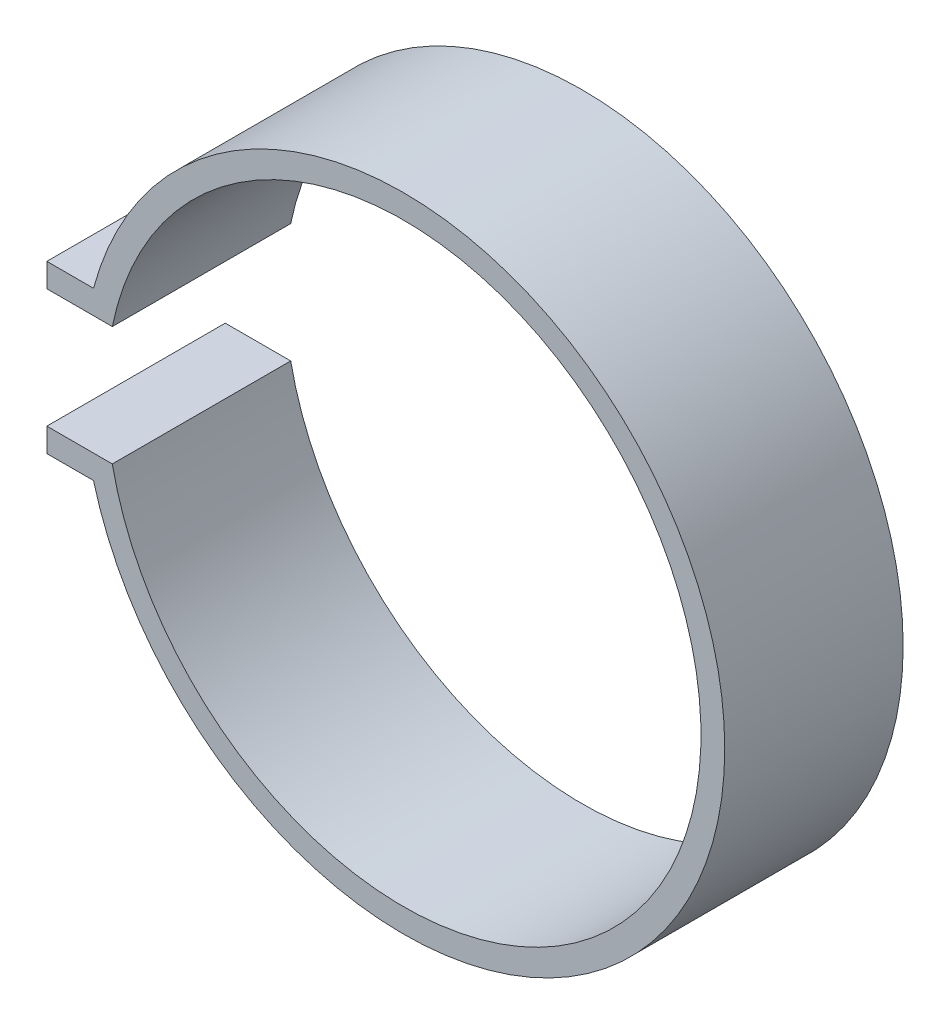
ISO-10303-21;
HEADER;
FILE_DESCRIPTION(('STEP AP214'),'2;1');
FILE_NAME('part.step','',(''),(''),'','','');
FILE_SCHEMA(('AUTOMOTIVE_DESIGN { 1 0 10303 214 1 1 1 1 }'));
ENDSEC;
DATA;
#1=APPLICATION_CONTEXT('core data for automotive mechanical design processes');
#2=APPLICATION_PROTOCOL_DEFINITION('international standard','automotive_design',2000,#1);
#3=PRODUCT_CONTEXT('',#1,'mechanical');
#4=PRODUCT('Part','Part','',(#3));
#5=PRODUCT_RELATED_PRODUCT_CATEGORY('part','',(#4));
#6=PRODUCT_DEFINITION_FORMATION('','',#4);
#7=PRODUCT_DEFINITION_CONTEXT('part definition',#1,'design');
#8=PRODUCT_DEFINITION('design','',#6,#7);
#9=PRODUCT_DEFINITION_SHAPE('','',#8);
#10=(LENGTH_UNIT() NAMED_UNIT(*) SI_UNIT(.MILLI.,.METRE.));
#11=(NAMED_UNIT(*) PLANE_ANGLE_UNIT() SI_UNIT($,.RADIAN.));
#12=(NAMED_UNIT(*) SI_UNIT($,.STERADIAN.) SOLID_ANGLE_UNIT());
#13=UNCERTAINTY_MEASURE_WITH_UNIT(LENGTH_MEASURE(1.E-05),#10,'distance_accuracy_value','');
#14=(GEOMETRIC_REPRESENTATION_CONTEXT(3) GLOBAL_UNCERTAINTY_ASSIGNED_CONTEXT((#13)) GLOBAL_UNIT_ASSIGNED_CONTEXT((#10,
#11,#12)) REPRESENTATION_CONTEXT('',''));
#15=CARTESIAN_POINT('',(0.,0.,0.));
#16=DIRECTION('',(0.,0.,1.));
#17=DIRECTION('',(1.,0.,0.));
#18=AXIS2_PLACEMENT_3D('',#15,#16,#17);
#19=CARTESIAN_POINT('',(-60.,14.,30.));
#20=DIRECTION('',(0.,-1.,0.));
#21=DIRECTION('',(1.,0.,0.));
#22=AXIS2_PLACEMENT_3D('',#19,#20,#21);
#23=PLANE('',#22);
#24=DIRECTION('',(-1.,0.,0.));
#25=VECTOR('',#24,1.);
#26=CARTESIAN_POINT('',(-60.,14.,0.));
#27=LINE('',#26,#25);
#28=CARTESIAN_POINT('',(-52.1536192416212,14.,0.));
#29=VERTEX_POINT('',#28);
#30=CARTESIAN_POINT('',(-60.,14.,0.));
#31=VERTEX_POINT('',#30);
#32=EDGE_CURVE('E134',#29,#31,#27,.T.);
#33=ORIENTED_EDGE('',*,*,#32,.T.);
#34=DIRECTION('',(0.,0.,-1.));
#35=VECTOR('',#34,1.);
#36=CARTESIAN_POINT('',(-60.,14.,30.));
#37=LINE('',#36,#35);
#38=CARTESIAN_POINT('',(-60.,14.,30.));
#39=VERTEX_POINT('',#38);
#40=EDGE_CURVE('E11',#39,#31,#37,.T.);
#41=ORIENTED_EDGE('',*,*,#40,.F.);
#42=DIRECTION('',(-1.,0.,0.));
#43=VECTOR('',#42,1.);
#44=CARTESIAN_POINT('',(-60.,14.,30.));
#45=LINE('',#44,#43);
#46=CARTESIAN_POINT('',(-52.1536192416212,14.,30.));
#47=VERTEX_POINT('',#46);
#48=EDGE_CURVE('E92',#47,#39,#45,.T.);
#49=ORIENTED_EDGE('',*,*,#48,.F.);
#50=DIRECTION('',(0.,0.,-1.));
#51=VECTOR('',#50,1.);
#52=CARTESIAN_POINT('',(-52.1536192416212,14.,30.));
#53=LINE('',#52,#51);
#54=EDGE_CURVE('E133',#47,#29,#53,.T.);
#55=ORIENTED_EDGE('',*,*,#54,.T.);
#56=EDGE_LOOP('',(#33,#41,#49,#55));
#57=FACE_BOUND('',#56,.T.);
#58=ADVANCED_FACE('F37',(#57),#23,.F.);
#59=CARTESIAN_POINT('',(-60.,10.,30.));
#60=DIRECTION('',(-1.,0.,0.));
#61=DIRECTION('',(0.,0.,1.));
#62=AXIS2_PLACEMENT_3D('',#59,#60,#61);
#63=PLANE('',#62);
#64=DIRECTION('',(0.,1.,0.));
#65=VECTOR('',#64,1.);
#66=CARTESIAN_POINT('',(-60.,10.,0.));
#67=LINE('',#66,#65);
#68=CARTESIAN_POINT('',(-60.,10.,0.));
#69=VERTEX_POINT('',#68);
#70=EDGE_CURVE('E137',#69,#31,#67,.T.);
#71=ORIENTED_EDGE('',*,*,#70,.F.);
#72=DIRECTION('',(0.,0.,-1.));
#73=VECTOR('',#72,1.);
#74=CARTESIAN_POINT('',(-60.,10.,30.));
#75=LINE('',#74,#73);
#76=CARTESIAN_POINT('',(-60.,10.,30.));
#77=VERTEX_POINT('',#76);
#78=EDGE_CURVE('E45',#77,#69,#75,.T.);
#79=ORIENTED_EDGE('',*,*,#78,.F.);
#80=DIRECTION('',(0.,1.,0.));
#81=VECTOR('',#80,1.);
#82=CARTESIAN_POINT('',(-60.,10.,30.));
#83=LINE('',#82,#81);
#84=EDGE_CURVE('E176',#77,#39,#83,.T.);
#85=ORIENTED_EDGE('',*,*,#84,.T.);
#86=ORIENTED_EDGE('',*,*,#40,.T.);
#87=EDGE_LOOP('',(#71,#79,#85,#86));
#88=FACE_BOUND('',#87,.T.);
#89=ADVANCED_FACE('F167',(#88),#63,.T.);
#90=CARTESIAN_POINT('',(-60.,10.,30.));
#91=DIRECTION('',(0.,-1.,0.));
#92=DIRECTION('',(1.,0.,0.));
#93=AXIS2_PLACEMENT_3D('',#90,#91,#92);
#94=PLANE('',#93);
#95=DIRECTION('',(-1.,0.,0.));
#96=VECTOR('',#95,1.);
#97=CARTESIAN_POINT('',(-60.,10.,0.));
#98=LINE('',#97,#96);
#99=CARTESIAN_POINT('',(-48.9897948556636,10.,0.));
#100=VERTEX_POINT('',#99);
#101=EDGE_CURVE('E140',#100,#69,#98,.T.);
#102=ORIENTED_EDGE('',*,*,#101,.F.);
#103=DIRECTION('',(0.,0.,-1.));
#104=VECTOR('',#103,1.);
#105=CARTESIAN_POINT('',(-48.9897948556636,10.,30.));
#106=LINE('',#105,#104);
#107=CARTESIAN_POINT('',(-48.9897948556636,10.,30.));
#108=VERTEX_POINT('',#107);
#109=EDGE_CURVE('E157',#108,#100,#106,.T.);
#110=ORIENTED_EDGE('',*,*,#109,.F.);
#111=DIRECTION('',(-1.,0.,0.));
#112=VECTOR('',#111,1.);
#113=CARTESIAN_POINT('',(-60.,10.,30.));
#114=LINE('',#113,#112);
#115=EDGE_CURVE('E164',#108,#77,#114,.T.);
#116=ORIENTED_EDGE('',*,*,#115,.T.);
#117=ORIENTED_EDGE('',*,*,#78,.T.);
#118=EDGE_LOOP('',(#102,#110,#116,#117));
#119=FACE_BOUND('',#118,.T.);
#120=ADVANCED_FACE('F162',(#119),#94,.T.);
#121=CARTESIAN_POINT('',(0.,0.,30.));
#122=DIRECTION('',(0.,0.,-1.));
#123=DIRECTION('',(-1.,0.,0.));
#124=AXIS2_PLACEMENT_3D('',#121,#122,#123);
#125=CYLINDRICAL_SURFACE('',#124,50.);
#126=CARTESIAN_POINT('',(0.,0.,0.));
#127=DIRECTION('',(0.,0.,1.));
#128=DIRECTION('',(1.,0.,0.));
#129=AXIS2_PLACEMENT_3D('',#126,#127,#128);
#130=CIRCLE('',#129,50.);
#131=CARTESIAN_POINT('',(-48.9897948556636,-10.,0.));
#132=VERTEX_POINT('',#131);
#133=EDGE_CURVE('E143',#132,#100,#130,.T.);
#134=ORIENTED_EDGE('',*,*,#133,.F.);
#135=DIRECTION('',(0.,0.,-1.));
#136=VECTOR('',#135,1.);
#137=CARTESIAN_POINT('',(-48.9897948556636,-10.,30.));
#138=LINE('',#137,#136);
#139=CARTESIAN_POINT('',(-48.9897948556636,-10.,30.));
#140=VERTEX_POINT('',#139);
#141=EDGE_CURVE('E155',#140,#132,#138,.T.);
#142=ORIENTED_EDGE('',*,*,#141,.F.);
#143=CARTESIAN_POINT('',(0.,0.,30.));
#144=DIRECTION('',(0.,0.,1.));
#145=DIRECTION('',(1.,0.,0.));
#146=AXIS2_PLACEMENT_3D('',#143,#144,#145);
#147=CIRCLE('',#146,50.);
#148=EDGE_CURVE('E128',#140,#108,#147,.T.);
#149=ORIENTED_EDGE('',*,*,#148,.T.);
#150=ORIENTED_EDGE('',*,*,#109,.T.);
#151=EDGE_LOOP('',(#134,#142,#149,#150));
#152=FACE_BOUND('',#151,.T.);
#153=ADVANCED_FACE('F174',(#152),#125,.F.);
#154=CARTESIAN_POINT('',(-60.,-10.,30.));
#155=DIRECTION('',(0.,1.,0.));
#156=DIRECTION('',(-1.,0.,0.));
#157=AXIS2_PLACEMENT_3D('',#154,#155,#156);
#158=PLANE('',#157);
#159=DIRECTION('',(1.,0.,0.));
#160=VECTOR('',#159,1.);
#161=CARTESIAN_POINT('',(-60.,-10.,0.));
#162=LINE('',#161,#160);
#163=CARTESIAN_POINT('',(-60.,-10.,0.));
#164=VERTEX_POINT('',#163);
#165=EDGE_CURVE('E146',#164,#132,#162,.T.);
#166=ORIENTED_EDGE('',*,*,#165,.F.);
#167=DIRECTION('',(0.,0.,-1.));
#168=VECTOR('',#167,1.);
#169=CARTESIAN_POINT('',(-60.,-10.,30.));
#170=LINE('',#169,#168);
#171=CARTESIAN_POINT('',(-60.,-10.,30.));
#172=VERTEX_POINT('',#171);
#173=EDGE_CURVE('E116',#172,#164,#170,.T.);
#174=ORIENTED_EDGE('',*,*,#173,.F.);
#175=DIRECTION('',(1.,0.,0.));
#176=VECTOR('',#175,1.);
#177=CARTESIAN_POINT('',(-60.,-10.,30.));
#178=LINE('',#177,#176);
#179=EDGE_CURVE('E126',#172,#140,#178,.T.);
#180=ORIENTED_EDGE('',*,*,#179,.T.);
#181=ORIENTED_EDGE('',*,*,#141,.T.);
#182=EDGE_LOOP('',(#166,#174,#180,#181));
#183=FACE_BOUND('',#182,.T.);
#184=ADVANCED_FACE('F181',(#183),#158,.T.);
#185=CARTESIAN_POINT('',(-60.,-14.,30.));
#186=DIRECTION('',(-1.,0.,0.));
#187=DIRECTION('',(0.,0.,1.));
#188=AXIS2_PLACEMENT_3D('',#185,#186,#187);
#189=PLANE('',#188);
#190=DIRECTION('',(0.,1.,0.));
#191=VECTOR('',#190,1.);
#192=CARTESIAN_POINT('',(-60.,-14.,0.));
#193=LINE('',#192,#191);
#194=CARTESIAN_POINT('',(-60.,-14.,0.));
#195=VERTEX_POINT('',#194);
#196=EDGE_CURVE('E115',#195,#164,#193,.T.);
#197=ORIENTED_EDGE('',*,*,#196,.F.);
#198=DIRECTION('',(0.,0.,-1.));
#199=VECTOR('',#198,1.);
#200=CARTESIAN_POINT('',(-60.,-14.,30.));
#201=LINE('',#200,#199);
#202=CARTESIAN_POINT('',(-60.,-14.,30.));
#203=VERTEX_POINT('',#202);
#204=EDGE_CURVE('E109',#203,#195,#201,.T.);
#205=ORIENTED_EDGE('',*,*,#204,.F.);
#206=DIRECTION('',(0.,1.,0.));
#207=VECTOR('',#206,1.);
#208=CARTESIAN_POINT('',(-60.,-14.,30.));
#209=LINE('',#208,#207);
#210=EDGE_CURVE('E113',#203,#172,#209,.T.);
#211=ORIENTED_EDGE('',*,*,#210,.T.);
#212=ORIENTED_EDGE('',*,*,#173,.T.);
#213=EDGE_LOOP('',(#197,#205,#211,#212));
#214=FACE_BOUND('',#213,.T.);
#215=ADVANCED_FACE('F111',(#214),#189,.T.);
#216=CARTESIAN_POINT('',(-60.,-14.,30.));
#217=DIRECTION('',(0.,1.,0.));
#218=DIRECTION('',(-1.,0.,0.));
#219=AXIS2_PLACEMENT_3D('',#216,#217,#218);
#220=PLANE('',#219);
#221=DIRECTION('',(1.,0.,0.));
#222=VECTOR('',#221,1.);
#223=CARTESIAN_POINT('',(-60.,-14.,0.));
#224=LINE('',#223,#222);
#225=CARTESIAN_POINT('',(-52.1536192416212,-14.,0.));
#226=VERTEX_POINT('',#225);
#227=EDGE_CURVE('E80',#195,#226,#224,.T.);
#228=ORIENTED_EDGE('',*,*,#227,.T.);
#229=DIRECTION('',(0.,0.,-1.));
#230=VECTOR('',#229,1.);
#231=CARTESIAN_POINT('',(-52.1536192416212,-14.,30.));
#232=LINE('',#231,#230);
#233=CARTESIAN_POINT('',(-52.1536192416212,-14.,30.));
#234=VERTEX_POINT('',#233);
#235=EDGE_CURVE('E117',#234,#226,#232,.T.);
#236=ORIENTED_EDGE('',*,*,#235,.F.);
#237=DIRECTION('',(1.,0.,0.));
#238=VECTOR('',#237,1.);
#239=CARTESIAN_POINT('',(-60.,-14.,30.));
#240=LINE('',#239,#238);
#241=EDGE_CURVE('E119',#203,#234,#240,.T.);
#242=ORIENTED_EDGE('',*,*,#241,.F.);
#243=ORIENTED_EDGE('',*,*,#204,.T.);
#244=EDGE_LOOP('',(#228,#236,#242,#243));
#245=FACE_BOUND('',#244,.T.);
#246=ADVANCED_FACE('F120',(#245),#220,.F.);
#247=CARTESIAN_POINT('',(0.,0.,30.));
#248=DIRECTION('',(0.,0.,-1.));
#249=DIRECTION('',(-1.,0.,0.));
#250=AXIS2_PLACEMENT_3D('',#247,#248,#249);
#251=CYLINDRICAL_SURFACE('',#250,54.);
#252=CARTESIAN_POINT('',(0.,0.,0.));
#253=DIRECTION('',(0.,0.,1.));
#254=DIRECTION('',(1.,0.,0.));
#255=AXIS2_PLACEMENT_3D('',#252,#253,#254);
#256=CIRCLE('',#255,54.);
#257=EDGE_CURVE('E86',#226,#29,#256,.T.);
#258=ORIENTED_EDGE('',*,*,#257,.T.);
#259=ORIENTED_EDGE('',*,*,#54,.F.);
#260=CARTESIAN_POINT('',(0.,0.,30.));
#261=DIRECTION('',(0.,0.,1.));
#262=DIRECTION('',(1.,0.,0.));
#263=AXIS2_PLACEMENT_3D('',#260,#261,#262);
#264=CIRCLE('',#263,54.);
#265=EDGE_CURVE('E53',#234,#47,#264,.T.);
#266=ORIENTED_EDGE('',*,*,#265,.F.);
#267=ORIENTED_EDGE('',*,*,#235,.T.);
#268=EDGE_LOOP('',(#258,#259,#266,#267));
#269=FACE_BOUND('',#268,.T.);
#270=ADVANCED_FACE('F183',(#269),#251,.T.);
#271=CARTESIAN_POINT('',(0.,0.,30.));
#272=DIRECTION('',(0.,0.,1.));
#273=DIRECTION('',(1.,0.,0.));
#274=AXIS2_PLACEMENT_3D('',#271,#272,#273);
#275=PLANE('',#274);
#276=ORIENTED_EDGE('',*,*,#48,.T.);
#277=ORIENTED_EDGE('',*,*,#84,.F.);
#278=ORIENTED_EDGE('',*,*,#115,.F.);
#279=ORIENTED_EDGE('',*,*,#148,.F.);
#280=ORIENTED_EDGE('',*,*,#179,.F.);
#281=ORIENTED_EDGE('',*,*,#210,.F.);
#282=ORIENTED_EDGE('',*,*,#241,.T.);
#283=ORIENTED_EDGE('',*,*,#265,.T.);
#284=EDGE_LOOP('',(#276,#277,#278,#279,#280,#281,#282,#283));
#285=FACE_BOUND('',#284,.T.);
#286=ADVANCED_FACE('F123',(#285),#275,.T.);
#287=CARTESIAN_POINT('',(0.,0.,0.));
#288=DIRECTION('',(0.,0.,1.));
#289=DIRECTION('',(1.,0.,0.));
#290=AXIS2_PLACEMENT_3D('',#287,#288,#289);
#291=PLANE('',#290);
#292=ORIENTED_EDGE('',*,*,#32,.F.);
#293=ORIENTED_EDGE('',*,*,#257,.F.);
#294=ORIENTED_EDGE('',*,*,#227,.F.);
#295=ORIENTED_EDGE('',*,*,#196,.T.);
#296=ORIENTED_EDGE('',*,*,#165,.T.);
#297=ORIENTED_EDGE('',*,*,#133,.T.);
#298=ORIENTED_EDGE('',*,*,#101,.T.);
#299=ORIENTED_EDGE('',*,*,#70,.T.);
#300=EDGE_LOOP('',(#292,#293,#294,#295,#296,#297,#298,#299));
#301=FACE_BOUND('',#300,.T.);
#302=ADVANCED_FACE('F170',(#301),#291,.F.);
#303=CLOSED_SHELL('',(#58,#89,#120,#153,#184,#215,#246,#270,#286,#302));
#304=MANIFOLD_SOLID_BREP('B2',#303);
#305=ADVANCED_BREP_SHAPE_REPRESENTATION('',(#18,#304),#14);
#306=SHAPE_DEFINITION_REPRESENTATION(#9,#305);
ENDSEC;
END-ISO-10303-21;
